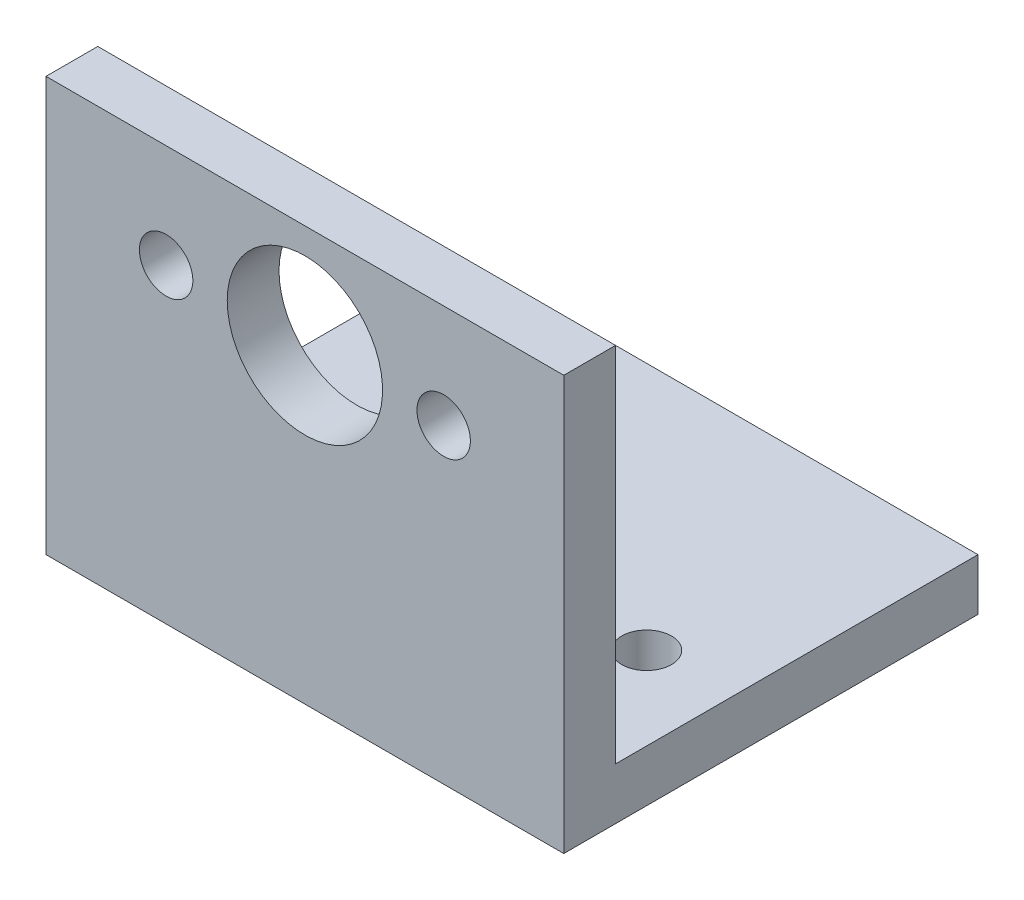
ISO-10303-21;
HEADER;
FILE_DESCRIPTION(('STEP AP214'),'2;1');
FILE_NAME('part.step','',(''),(''),'','','');
FILE_SCHEMA(('AUTOMOTIVE_DESIGN { 1 0 10303 214 1 1 1 1 }'));
ENDSEC;
DATA;
#1=APPLICATION_CONTEXT('core data for automotive mechanical design processes');
#2=APPLICATION_PROTOCOL_DEFINITION('international standard','automotive_design',2000,#1);
#3=PRODUCT_CONTEXT('',#1,'mechanical');
#4=PRODUCT('Part','Part','',(#3));
#5=PRODUCT_RELATED_PRODUCT_CATEGORY('part','',(#4));
#6=PRODUCT_DEFINITION_FORMATION('','',#4);
#7=PRODUCT_DEFINITION_CONTEXT('part definition',#1,'design');
#8=PRODUCT_DEFINITION('design','',#6,#7);
#9=PRODUCT_DEFINITION_SHAPE('','',#8);
#10=(LENGTH_UNIT() NAMED_UNIT(*) SI_UNIT(.MILLI.,.METRE.));
#11=(NAMED_UNIT(*) PLANE_ANGLE_UNIT() SI_UNIT($,.RADIAN.));
#12=(NAMED_UNIT(*) SI_UNIT($,.STERADIAN.) SOLID_ANGLE_UNIT());
#13=UNCERTAINTY_MEASURE_WITH_UNIT(LENGTH_MEASURE(1.E-05),#10,'distance_accuracy_value','');
#14=(GEOMETRIC_REPRESENTATION_CONTEXT(3) GLOBAL_UNCERTAINTY_ASSIGNED_CONTEXT((#13)) GLOBAL_UNIT_ASSIGNED_CONTEXT((#10,
#11,#12)) REPRESENTATION_CONTEXT('',''));
#15=CARTESIAN_POINT('',(0.,0.,0.));
#16=DIRECTION('',(0.,0.,1.));
#17=DIRECTION('',(1.,0.,0.));
#18=AXIS2_PLACEMENT_3D('',#15,#16,#17);
#19=CARTESIAN_POINT('',(31.75,25.4,0.));
#20=DIRECTION('',(0.,0.,-1.));
#21=DIRECTION('',(0.,1.,0.));
#22=AXIS2_PLACEMENT_3D('',#19,#20,#21);
#23=PLANE('',#22);
#24=CARTESIAN_POINT('',(24.384,19.05,0.));
#25=DIRECTION('',(0.,0.,-1.));
#26=DIRECTION('',(-1.,0.,0.));
#27=AXIS2_PLACEMENT_3D('',#24,#25,#26);
#28=CIRCLE('',#27,1.6383);
#29=CARTESIAN_POINT('',(22.7457,19.05,0.));
#30=VERTEX_POINT('',#29);
#31=EDGE_CURVE('E183',#30,#30,#28,.T.);
#32=ORIENTED_EDGE('',*,*,#31,.T.);
#33=EDGE_LOOP('',(#32));
#34=FACE_BOUND('',#33,.T.);
#35=CARTESIAN_POINT('',(7.366,19.05,0.));
#36=DIRECTION('',(0.,0.,-1.));
#37=DIRECTION('',(-1.,0.,0.));
#38=AXIS2_PLACEMENT_3D('',#35,#36,#37);
#39=CIRCLE('',#38,1.6383);
#40=CARTESIAN_POINT('',(5.7277,19.05,0.));
#41=VERTEX_POINT('',#40);
#42=EDGE_CURVE('E187',#41,#41,#39,.T.);
#43=ORIENTED_EDGE('',*,*,#42,.T.);
#44=EDGE_LOOP('',(#43));
#45=FACE_BOUND('',#44,.T.);
#46=CARTESIAN_POINT('',(15.875,19.05,0.));
#47=DIRECTION('',(0.,0.,-1.));
#48=DIRECTION('',(-1.,0.,0.));
#49=AXIS2_PLACEMENT_3D('',#46,#47,#48);
#50=CIRCLE('',#49,4.7625);
#51=CARTESIAN_POINT('',(11.1125,19.05,0.));
#52=VERTEX_POINT('',#51);
#53=EDGE_CURVE('E133',#52,#52,#50,.T.);
#54=ORIENTED_EDGE('',*,*,#53,.T.);
#55=EDGE_LOOP('',(#54));
#56=FACE_BOUND('',#55,.T.);
#57=DIRECTION('',(0.,-1.,0.));
#58=VECTOR('',#57,1.);
#59=CARTESIAN_POINT('',(0.,25.4,0.));
#60=LINE('',#59,#58);
#61=CARTESIAN_POINT('',(0.,25.4,0.));
#62=VERTEX_POINT('',#61);
#63=CARTESIAN_POINT('',(0.,0.,0.));
#64=VERTEX_POINT('',#63);
#65=EDGE_CURVE('E128',#62,#64,#60,.T.);
#66=ORIENTED_EDGE('',*,*,#65,.T.);
#67=DIRECTION('',(-1.,0.,0.));
#68=VECTOR('',#67,1.);
#69=CARTESIAN_POINT('',(31.75,0.,0.));
#70=LINE('',#69,#68);
#71=CARTESIAN_POINT('',(31.75,0.,0.));
#72=VERTEX_POINT('',#71);
#73=EDGE_CURVE('E11',#72,#64,#70,.T.);
#74=ORIENTED_EDGE('',*,*,#73,.F.);
#75=DIRECTION('',(0.,-1.,0.));
#76=VECTOR('',#75,1.);
#77=CARTESIAN_POINT('',(31.75,25.4,0.));
#78=LINE('',#77,#76);
#79=CARTESIAN_POINT('',(31.75,25.4,0.));
#80=VERTEX_POINT('',#79);
#81=EDGE_CURVE('E145',#80,#72,#78,.T.);
#82=ORIENTED_EDGE('',*,*,#81,.F.);
#83=DIRECTION('',(-1.,0.,0.));
#84=VECTOR('',#83,1.);
#85=CARTESIAN_POINT('',(31.75,25.4,0.));
#86=LINE('',#85,#84);
#87=EDGE_CURVE('E124',#80,#62,#86,.T.);
#88=ORIENTED_EDGE('',*,*,#87,.T.);
#89=EDGE_LOOP('',(#66,#74,#82,#88));
#90=FACE_BOUND('',#89,.T.);
#91=ADVANCED_FACE('F39',(#34,#45,#56,#90),#23,.F.);
#92=CARTESIAN_POINT('',(31.75,0.,0.));
#93=DIRECTION('',(0.,1.,0.));
#94=DIRECTION('',(0.,0.,1.));
#95=AXIS2_PLACEMENT_3D('',#92,#93,#94);
#96=PLANE('',#95);
#97=CARTESIAN_POINT('',(26.67,0.,-10.16));
#98=DIRECTION('',(0.,1.,0.));
#99=DIRECTION('',(0.,0.,1.));
#100=AXIS2_PLACEMENT_3D('',#97,#98,#99);
#101=CIRCLE('',#100,1.524);
#102=CARTESIAN_POINT('',(26.67,0.,-8.636));
#103=VERTEX_POINT('',#102);
#104=EDGE_CURVE('E220',#103,#103,#101,.T.);
#105=ORIENTED_EDGE('',*,*,#104,.T.);
#106=EDGE_LOOP('',(#105));
#107=FACE_BOUND('',#106,.T.);
#108=CARTESIAN_POINT('',(5.08,0.,-21.59));
#109=DIRECTION('',(0.,1.,0.));
#110=DIRECTION('',(0.,0.,1.));
#111=AXIS2_PLACEMENT_3D('',#108,#109,#110);
#112=CIRCLE('',#111,1.524);
#113=CARTESIAN_POINT('',(5.08,0.,-20.066));
#114=VERTEX_POINT('',#113);
#115=EDGE_CURVE('E213',#114,#114,#112,.T.);
#116=ORIENTED_EDGE('',*,*,#115,.T.);
#117=EDGE_LOOP('',(#116));
#118=FACE_BOUND('',#117,.T.);
#119=DIRECTION('',(0.,0.,-1.));
#120=VECTOR('',#119,1.);
#121=CARTESIAN_POINT('',(0.,0.,0.));
#122=LINE('',#121,#120);
#123=CARTESIAN_POINT('',(0.,0.,-25.4));
#124=VERTEX_POINT('',#123);
#125=EDGE_CURVE('E132',#64,#124,#122,.T.);
#126=ORIENTED_EDGE('',*,*,#125,.T.);
#127=DIRECTION('',(-1.,0.,0.));
#128=VECTOR('',#127,1.);
#129=CARTESIAN_POINT('',(31.75,0.,-25.4));
#130=LINE('',#129,#128);
#131=CARTESIAN_POINT('',(31.75,0.,-25.4));
#132=VERTEX_POINT('',#131);
#133=EDGE_CURVE('E48',#132,#124,#130,.T.);
#134=ORIENTED_EDGE('',*,*,#133,.F.);
#135=DIRECTION('',(0.,0.,-1.));
#136=VECTOR('',#135,1.);
#137=CARTESIAN_POINT('',(31.75,0.,0.));
#138=LINE('',#137,#136);
#139=EDGE_CURVE('E93',#72,#132,#138,.T.);
#140=ORIENTED_EDGE('',*,*,#139,.F.);
#141=ORIENTED_EDGE('',*,*,#73,.T.);
#142=EDGE_LOOP('',(#126,#134,#140,#141));
#143=FACE_BOUND('',#142,.T.);
#144=ADVANCED_FACE('F174',(#107,#118,#143),#96,.F.);
#145=CARTESIAN_POINT('',(31.75,0.,-25.4));
#146=DIRECTION('',(0.,0.,1.));
#147=DIRECTION('',(1.,0.,0.));
#148=AXIS2_PLACEMENT_3D('',#145,#146,#147);
#149=PLANE('',#148);
#150=DIRECTION('',(0.,1.,0.));
#151=VECTOR('',#150,1.);
#152=CARTESIAN_POINT('',(0.,0.,-25.4));
#153=LINE('',#152,#151);
#154=CARTESIAN_POINT('',(0.,3.175,-25.4));
#155=VERTEX_POINT('',#154);
#156=EDGE_CURVE('E136',#124,#155,#153,.T.);
#157=ORIENTED_EDGE('',*,*,#156,.T.);
#158=DIRECTION('',(-1.,0.,0.));
#159=VECTOR('',#158,1.);
#160=CARTESIAN_POINT('',(31.75,3.175,-25.4));
#161=LINE('',#160,#159);
#162=CARTESIAN_POINT('',(31.75,3.175,-25.4));
#163=VERTEX_POINT('',#162);
#164=EDGE_CURVE('E117',#163,#155,#161,.T.);
#165=ORIENTED_EDGE('',*,*,#164,.F.);
#166=DIRECTION('',(0.,1.,0.));
#167=VECTOR('',#166,1.);
#168=CARTESIAN_POINT('',(31.75,0.,-25.4));
#169=LINE('',#168,#167);
#170=EDGE_CURVE('E106',#132,#163,#169,.T.);
#171=ORIENTED_EDGE('',*,*,#170,.F.);
#172=ORIENTED_EDGE('',*,*,#133,.T.);
#173=EDGE_LOOP('',(#157,#165,#171,#172));
#174=FACE_BOUND('',#173,.T.);
#175=ADVANCED_FACE('F155',(#174),#149,.F.);
#176=CARTESIAN_POINT('',(31.75,3.175,-25.4));
#177=DIRECTION('',(0.,-1.,0.));
#178=DIRECTION('',(0.,0.,-1.));
#179=AXIS2_PLACEMENT_3D('',#176,#177,#178);
#180=PLANE('',#179);
#181=CARTESIAN_POINT('',(26.67,3.175,-10.16));
#182=DIRECTION('',(0.,1.,0.));
#183=DIRECTION('',(0.,0.,1.));
#184=AXIS2_PLACEMENT_3D('',#181,#182,#183);
#185=CIRCLE('',#184,1.524);
#186=CARTESIAN_POINT('',(26.67,3.175,-8.636));
#187=VERTEX_POINT('',#186);
#188=EDGE_CURVE('E224',#187,#187,#185,.T.);
#189=ORIENTED_EDGE('',*,*,#188,.F.);
#190=EDGE_LOOP('',(#189));
#191=FACE_BOUND('',#190,.T.);
#192=CARTESIAN_POINT('',(5.08,3.175,-21.59));
#193=DIRECTION('',(0.,1.,0.));
#194=DIRECTION('',(0.,0.,1.));
#195=AXIS2_PLACEMENT_3D('',#192,#193,#194);
#196=CIRCLE('',#195,1.524);
#197=CARTESIAN_POINT('',(5.08,3.175,-20.066));
#198=VERTEX_POINT('',#197);
#199=EDGE_CURVE('E216',#198,#198,#196,.T.);
#200=ORIENTED_EDGE('',*,*,#199,.F.);
#201=EDGE_LOOP('',(#200));
#202=FACE_BOUND('',#201,.T.);
#203=DIRECTION('',(0.,0.,1.));
#204=VECTOR('',#203,1.);
#205=CARTESIAN_POINT('',(0.,3.175,-25.4));
#206=LINE('',#205,#204);
#207=CARTESIAN_POINT('',(0.,3.175,-3.175));
#208=VERTEX_POINT('',#207);
#209=EDGE_CURVE('E115',#155,#208,#206,.T.);
#210=ORIENTED_EDGE('',*,*,#209,.T.);
#211=DIRECTION('',(-1.,0.,0.));
#212=VECTOR('',#211,1.);
#213=CARTESIAN_POINT('',(31.75,3.175,-3.175));
#214=LINE('',#213,#212);
#215=CARTESIAN_POINT('',(31.75,3.175,-3.175));
#216=VERTEX_POINT('',#215);
#217=EDGE_CURVE('E112',#216,#208,#214,.T.);
#218=ORIENTED_EDGE('',*,*,#217,.F.);
#219=DIRECTION('',(0.,0.,1.));
#220=VECTOR('',#219,1.);
#221=CARTESIAN_POINT('',(31.75,3.175,-25.4));
#222=LINE('',#221,#220);
#223=EDGE_CURVE('E100',#163,#216,#222,.T.);
#224=ORIENTED_EDGE('',*,*,#223,.F.);
#225=ORIENTED_EDGE('',*,*,#164,.T.);
#226=EDGE_LOOP('',(#210,#218,#224,#225));
#227=FACE_BOUND('',#226,.T.);
#228=ADVANCED_FACE('F113',(#191,#202,#227),#180,.F.);
#229=CARTESIAN_POINT('',(31.75,3.175,-3.175));
#230=DIRECTION('',(0.,0.,1.));
#231=DIRECTION('',(1.,0.,0.));
#232=AXIS2_PLACEMENT_3D('',#229,#230,#231);
#233=PLANE('',#232);
#234=CARTESIAN_POINT('',(24.384,19.05,-3.175));
#235=DIRECTION('',(0.,0.,-1.));
#236=DIRECTION('',(-1.,0.,0.));
#237=AXIS2_PLACEMENT_3D('',#234,#235,#236);
#238=CIRCLE('',#237,1.6383);
#239=CARTESIAN_POINT('',(22.7457,19.05,-3.175));
#240=VERTEX_POINT('',#239);
#241=EDGE_CURVE('E209',#240,#240,#238,.T.);
#242=ORIENTED_EDGE('',*,*,#241,.F.);
#243=EDGE_LOOP('',(#242));
#244=FACE_BOUND('',#243,.T.);
#245=CARTESIAN_POINT('',(7.366,19.05,-3.175));
#246=DIRECTION('',(0.,0.,-1.));
#247=DIRECTION('',(-1.,0.,0.));
#248=AXIS2_PLACEMENT_3D('',#245,#246,#247);
#249=CIRCLE('',#248,1.6383);
#250=CARTESIAN_POINT('',(5.7277,19.05,-3.175));
#251=VERTEX_POINT('',#250);
#252=EDGE_CURVE('E198',#251,#251,#249,.T.);
#253=ORIENTED_EDGE('',*,*,#252,.F.);
#254=EDGE_LOOP('',(#253));
#255=FACE_BOUND('',#254,.T.);
#256=CARTESIAN_POINT('',(15.875,19.05,-3.175));
#257=DIRECTION('',(0.,0.,-1.));
#258=DIRECTION('',(-1.,0.,0.));
#259=AXIS2_PLACEMENT_3D('',#256,#257,#258);
#260=CIRCLE('',#259,4.7625);
#261=CARTESIAN_POINT('',(11.1125,19.05,-3.175));
#262=VERTEX_POINT('',#261);
#263=EDGE_CURVE('E192',#262,#262,#260,.T.);
#264=ORIENTED_EDGE('',*,*,#263,.F.);
#265=EDGE_LOOP('',(#264));
#266=FACE_BOUND('',#265,.T.);
#267=DIRECTION('',(0.,1.,0.));
#268=VECTOR('',#267,1.);
#269=CARTESIAN_POINT('',(0.,3.175,-3.175));
#270=LINE('',#269,#268);
#271=CARTESIAN_POINT('',(0.,25.4,-3.175));
#272=VERTEX_POINT('',#271);
#273=EDGE_CURVE('E79',#208,#272,#270,.T.);
#274=ORIENTED_EDGE('',*,*,#273,.T.);
#275=DIRECTION('',(-1.,0.,0.));
#276=VECTOR('',#275,1.);
#277=CARTESIAN_POINT('',(31.75,25.4,-3.175));
#278=LINE('',#277,#276);
#279=CARTESIAN_POINT('',(31.75,25.4,-3.175));
#280=VERTEX_POINT('',#279);
#281=EDGE_CURVE('E118',#280,#272,#278,.T.);
#282=ORIENTED_EDGE('',*,*,#281,.F.);
#283=DIRECTION('',(0.,1.,0.));
#284=VECTOR('',#283,1.);
#285=CARTESIAN_POINT('',(31.75,3.175,-3.175));
#286=LINE('',#285,#284);
#287=EDGE_CURVE('E104',#216,#280,#286,.T.);
#288=ORIENTED_EDGE('',*,*,#287,.F.);
#289=ORIENTED_EDGE('',*,*,#217,.T.);
#290=EDGE_LOOP('',(#274,#282,#288,#289));
#291=FACE_BOUND('',#290,.T.);
#292=ADVANCED_FACE('F120',(#244,#255,#266,#291),#233,.F.);
#293=CARTESIAN_POINT('',(31.75,25.4,-3.175));
#294=DIRECTION('',(0.,-1.,0.));
#295=DIRECTION('',(0.,0.,-1.));
#296=AXIS2_PLACEMENT_3D('',#293,#294,#295);
#297=PLANE('',#296);
#298=DIRECTION('',(0.,0.,1.));
#299=VECTOR('',#298,1.);
#300=CARTESIAN_POINT('',(0.,25.4,-3.175));
#301=LINE('',#300,#299);
#302=EDGE_CURVE('E85',#272,#62,#301,.T.);
#303=ORIENTED_EDGE('',*,*,#302,.T.);
#304=ORIENTED_EDGE('',*,*,#87,.F.);
#305=DIRECTION('',(0.,0.,1.));
#306=VECTOR('',#305,1.);
#307=CARTESIAN_POINT('',(31.75,25.4,-3.175));
#308=LINE('',#307,#306);
#309=EDGE_CURVE('E56',#280,#80,#308,.T.);
#310=ORIENTED_EDGE('',*,*,#309,.F.);
#311=ORIENTED_EDGE('',*,*,#281,.T.);
#312=EDGE_LOOP('',(#303,#304,#310,#311));
#313=FACE_BOUND('',#312,.T.);
#314=ADVANCED_FACE('F162',(#313),#297,.F.);
#315=CARTESIAN_POINT('',(31.75,0.,0.));
#316=DIRECTION('',(1.,0.,0.));
#317=DIRECTION('',(0.,0.,-1.));
#318=AXIS2_PLACEMENT_3D('',#315,#316,#317);
#319=PLANE('',#318);
#320=ORIENTED_EDGE('',*,*,#81,.T.);
#321=ORIENTED_EDGE('',*,*,#139,.T.);
#322=ORIENTED_EDGE('',*,*,#170,.T.);
#323=ORIENTED_EDGE('',*,*,#223,.T.);
#324=ORIENTED_EDGE('',*,*,#287,.T.);
#325=ORIENTED_EDGE('',*,*,#309,.T.);
#326=EDGE_LOOP('',(#320,#321,#322,#323,#324,#325));
#327=FACE_BOUND('',#326,.T.);
#328=ADVANCED_FACE('F102',(#327),#319,.T.);
#329=CARTESIAN_POINT('',(0.,0.,0.));
#330=DIRECTION('',(1.,0.,0.));
#331=DIRECTION('',(0.,0.,-1.));
#332=AXIS2_PLACEMENT_3D('',#329,#330,#331);
#333=PLANE('',#332);
#334=ORIENTED_EDGE('',*,*,#65,.F.);
#335=ORIENTED_EDGE('',*,*,#302,.F.);
#336=ORIENTED_EDGE('',*,*,#273,.F.);
#337=ORIENTED_EDGE('',*,*,#209,.F.);
#338=ORIENTED_EDGE('',*,*,#156,.F.);
#339=ORIENTED_EDGE('',*,*,#125,.F.);
#340=EDGE_LOOP('',(#334,#335,#336,#337,#338,#339));
#341=FACE_BOUND('',#340,.T.);
#342=ADVANCED_FACE('F158',(#341),#333,.F.);
#343=CARTESIAN_POINT('',(15.875,19.05,0.));
#344=DIRECTION('',(0.,0.,-1.));
#345=DIRECTION('',(-1.,0.,0.));
#346=AXIS2_PLACEMENT_3D('',#343,#344,#345);
#347=CYLINDRICAL_SURFACE('',#346,4.7625);
#348=CARTESIAN_POINT('',(11.1125,19.05,0.));
#349=CARTESIAN_POINT('',(11.1125,19.05,-0.0330729166666666));
#350=CARTESIAN_POINT('',(11.1125,19.05,-0.0661458333333334));
#351=CARTESIAN_POINT('',(11.1125,19.05,-0.132291666666667));
#352=CARTESIAN_POINT('',(11.1125,19.05,-0.165364583333334));
#353=CARTESIAN_POINT('',(11.1125,19.05,-0.231510416666667));
#354=CARTESIAN_POINT('',(11.1125,19.05,-0.264583333333334));
#355=CARTESIAN_POINT('',(11.1125,19.05,-0.330729166666667));
#356=CARTESIAN_POINT('',(11.1125,19.05,-0.363802083333334));
#357=CARTESIAN_POINT('',(11.1125,19.05,-0.429947916666667));
#358=CARTESIAN_POINT('',(11.1125,19.05,-0.463020833333334));
#359=CARTESIAN_POINT('',(11.1125,19.05,-0.529166666666667));
#360=CARTESIAN_POINT('',(11.1125,19.05,-0.562239583333334));
#361=CARTESIAN_POINT('',(11.1125,19.05,-0.628385416666667));
#362=CARTESIAN_POINT('',(11.1125,19.05,-0.661458333333334));
#363=CARTESIAN_POINT('',(11.1125,19.05,-0.727604166666667));
#364=CARTESIAN_POINT('',(11.1125,19.05,-0.760677083333334));
#365=CARTESIAN_POINT('',(11.1125,19.05,-0.826822916666668));
#366=CARTESIAN_POINT('',(11.1125,19.05,-0.859895833333334));
#367=CARTESIAN_POINT('',(11.1125,19.05,-0.926041666666668));
#368=CARTESIAN_POINT('',(11.1125,19.05,-0.959114583333334));
#369=CARTESIAN_POINT('',(11.1125,19.05,-1.02526041666667));
#370=CARTESIAN_POINT('',(11.1125,19.05,-1.05833333333333));
#371=CARTESIAN_POINT('',(11.1125,19.05,-1.12447916666667));
#372=CARTESIAN_POINT('',(11.1125,19.05,-1.15755208333333));
#373=CARTESIAN_POINT('',(11.1125,19.05,-1.22369791666667));
#374=CARTESIAN_POINT('',(11.1125,19.05,-1.25677083333333));
#375=CARTESIAN_POINT('',(11.1125,19.05,-1.32291666666667));
#376=CARTESIAN_POINT('',(11.1125,19.05,-1.35598958333333));
#377=CARTESIAN_POINT('',(11.1125,19.05,-1.42213541666667));
#378=CARTESIAN_POINT('',(11.1125,19.05,-1.45520833333333));
#379=CARTESIAN_POINT('',(11.1125,19.05,-1.52135416666667));
#380=CARTESIAN_POINT('',(11.1125,19.05,-1.55442708333334));
#381=CARTESIAN_POINT('',(11.1125,19.05,-1.62057291666667));
#382=CARTESIAN_POINT('',(11.1125,19.05,-1.65364583333334));
#383=CARTESIAN_POINT('',(11.1125,19.05,-1.71979166666667));
#384=CARTESIAN_POINT('',(11.1125,19.05,-1.75286458333334));
#385=CARTESIAN_POINT('',(11.1125,19.05,-1.81901041666667));
#386=CARTESIAN_POINT('',(11.1125,19.05,-1.85208333333334));
#387=CARTESIAN_POINT('',(11.1125,19.05,-1.91822916666667));
#388=CARTESIAN_POINT('',(11.1125,19.05,-1.95130208333334));
#389=CARTESIAN_POINT('',(11.1125,19.05,-2.01744791666667));
#390=CARTESIAN_POINT('',(11.1125,19.05,-2.05052083333334));
#391=CARTESIAN_POINT('',(11.1125,19.05,-2.11666666666667));
#392=CARTESIAN_POINT('',(11.1125,19.05,-2.14973958333334));
#393=CARTESIAN_POINT('',(11.1125,19.05,-2.21588541666667));
#394=CARTESIAN_POINT('',(11.1125,19.05,-2.24895833333334));
#395=CARTESIAN_POINT('',(11.1125,19.05,-2.31510416666667));
#396=CARTESIAN_POINT('',(11.1125,19.05,-2.34817708333334));
#397=CARTESIAN_POINT('',(11.1125,19.05,-2.41432291666667));
#398=CARTESIAN_POINT('',(11.1125,19.05,-2.44739583333334));
#399=CARTESIAN_POINT('',(11.1125,19.05,-2.51354166666667));
#400=CARTESIAN_POINT('',(11.1125,19.05,-2.54661458333334));
#401=CARTESIAN_POINT('',(11.1125,19.05,-2.61276041666667));
#402=CARTESIAN_POINT('',(11.1125,19.05,-2.64583333333334));
#403=CARTESIAN_POINT('',(11.1125,19.05,-2.71197916666667));
#404=CARTESIAN_POINT('',(11.1125,19.05,-2.74505208333334));
#405=CARTESIAN_POINT('',(11.1125,19.05,-2.81119791666667));
#406=CARTESIAN_POINT('',(11.1125,19.05,-2.84427083333334));
#407=CARTESIAN_POINT('',(11.1125,19.05,-2.91041666666667));
#408=CARTESIAN_POINT('',(11.1125,19.05,-2.94348958333334));
#409=CARTESIAN_POINT('',(11.1125,19.05,-3.00963541666667));
#410=CARTESIAN_POINT('',(11.1125,19.05,-3.04270833333334));
#411=CARTESIAN_POINT('',(11.1125,19.05,-3.10885416666667));
#412=CARTESIAN_POINT('',(11.1125,19.05,-3.14192708333334));
#413=CARTESIAN_POINT('',(11.1125,19.05,-3.175));
#414=B_SPLINE_CURVE_WITH_KNOTS('',3,(#348,#349,#350,#351,#352,#353,#354,#355,#356,#357,#358,
#359,#360,#361,#362,#363,#364,#365,#366,#367,#368,#369,#370,#371,#372,#373,#374,#375,#376,#377,
#378,#379,#380,#381,#382,#383,#384,#385,#386,#387,#388,#389,#390,#391,#392,#393,#394,#395,#396,
#397,#398,#399,#400,#401,#402,#403,#404,#405,#406,#407,#408,#409,#410,#411,#412,#413),
.UNSPECIFIED.,.F.,.F.,(4,2,2,2,2,2,2,2,2,2,2,2,2,2,2,2,2,2,2,2,2,2,2,2,2,2,2,2,2,2,2,2,4),(0.,
0.0992187500000001,0.1984375,0.29765625,0.396875,0.496093750000001,0.595312500000001,
0.694531250000001,0.793750000000001,0.892968750000001,0.992187500000001,1.09140625,1.190625,
1.28984375,1.3890625,1.48828125,1.5875,1.68671875,1.7859375,1.88515625,1.984375,2.08359375,
2.1828125,2.28203125,2.38125,2.48046875,2.5796875,2.67890625,2.778125,2.87734375,2.9765625,
3.07578125,3.175),.UNSPECIFIED.);
#415=EDGE_CURVE('BSEAM259',#52,#262,#414,.T.);
#416=ORIENTED_EDGE('',*,*,#53,.F.);
#417=ORIENTED_EDGE('',*,*,#263,.T.);
#418=ORIENTED_EDGE('',*,*,#415,.T.);
#419=ORIENTED_EDGE('',*,*,#415,.F.);
#420=EDGE_LOOP('',(#416,#418,#417,#419));
#421=FACE_BOUND('',#420,.T.);
#422=ADVANCED_FACE('F259',(#421),#347,.F.);
#423=CARTESIAN_POINT('',(7.366,19.05,0.));
#424=DIRECTION('',(0.,0.,-1.));
#425=DIRECTION('',(-1.,0.,0.));
#426=AXIS2_PLACEMENT_3D('',#423,#424,#425);
#427=CYLINDRICAL_SURFACE('',#426,1.6383);
#428=CARTESIAN_POINT('',(5.7277,19.05,0.));
#429=CARTESIAN_POINT('',(5.7277,19.05,-0.0330729166666666));
#430=CARTESIAN_POINT('',(5.7277,19.05,-0.0661458333333334));
#431=CARTESIAN_POINT('',(5.7277,19.05,-0.132291666666667));
#432=CARTESIAN_POINT('',(5.7277,19.05,-0.165364583333334));
#433=CARTESIAN_POINT('',(5.7277,19.05,-0.231510416666667));
#434=CARTESIAN_POINT('',(5.7277,19.05,-0.264583333333334));
#435=CARTESIAN_POINT('',(5.7277,19.05,-0.330729166666667));
#436=CARTESIAN_POINT('',(5.7277,19.05,-0.363802083333334));
#437=CARTESIAN_POINT('',(5.7277,19.05,-0.429947916666667));
#438=CARTESIAN_POINT('',(5.7277,19.05,-0.463020833333334));
#439=CARTESIAN_POINT('',(5.7277,19.05,-0.529166666666667));
#440=CARTESIAN_POINT('',(5.7277,19.05,-0.562239583333334));
#441=CARTESIAN_POINT('',(5.7277,19.05,-0.628385416666667));
#442=CARTESIAN_POINT('',(5.7277,19.05,-0.661458333333334));
#443=CARTESIAN_POINT('',(5.7277,19.05,-0.727604166666667));
#444=CARTESIAN_POINT('',(5.7277,19.05,-0.760677083333334));
#445=CARTESIAN_POINT('',(5.7277,19.05,-0.826822916666668));
#446=CARTESIAN_POINT('',(5.7277,19.05,-0.859895833333334));
#447=CARTESIAN_POINT('',(5.7277,19.05,-0.926041666666668));
#448=CARTESIAN_POINT('',(5.7277,19.05,-0.959114583333334));
#449=CARTESIAN_POINT('',(5.7277,19.05,-1.02526041666667));
#450=CARTESIAN_POINT('',(5.7277,19.05,-1.05833333333333));
#451=CARTESIAN_POINT('',(5.7277,19.05,-1.12447916666667));
#452=CARTESIAN_POINT('',(5.7277,19.05,-1.15755208333333));
#453=CARTESIAN_POINT('',(5.7277,19.05,-1.22369791666667));
#454=CARTESIAN_POINT('',(5.7277,19.05,-1.25677083333333));
#455=CARTESIAN_POINT('',(5.7277,19.05,-1.32291666666667));
#456=CARTESIAN_POINT('',(5.7277,19.05,-1.35598958333333));
#457=CARTESIAN_POINT('',(5.7277,19.05,-1.42213541666667));
#458=CARTESIAN_POINT('',(5.7277,19.05,-1.45520833333333));
#459=CARTESIAN_POINT('',(5.7277,19.05,-1.52135416666667));
#460=CARTESIAN_POINT('',(5.7277,19.05,-1.55442708333334));
#461=CARTESIAN_POINT('',(5.7277,19.05,-1.62057291666667));
#462=CARTESIAN_POINT('',(5.7277,19.05,-1.65364583333334));
#463=CARTESIAN_POINT('',(5.7277,19.05,-1.71979166666667));
#464=CARTESIAN_POINT('',(5.7277,19.05,-1.75286458333334));
#465=CARTESIAN_POINT('',(5.7277,19.05,-1.81901041666667));
#466=CARTESIAN_POINT('',(5.7277,19.05,-1.85208333333334));
#467=CARTESIAN_POINT('',(5.7277,19.05,-1.91822916666667));
#468=CARTESIAN_POINT('',(5.7277,19.05,-1.95130208333334));
#469=CARTESIAN_POINT('',(5.7277,19.05,-2.01744791666667));
#470=CARTESIAN_POINT('',(5.7277,19.05,-2.05052083333334));
#471=CARTESIAN_POINT('',(5.7277,19.05,-2.11666666666667));
#472=CARTESIAN_POINT('',(5.7277,19.05,-2.14973958333334));
#473=CARTESIAN_POINT('',(5.7277,19.05,-2.21588541666667));
#474=CARTESIAN_POINT('',(5.7277,19.05,-2.24895833333334));
#475=CARTESIAN_POINT('',(5.7277,19.05,-2.31510416666667));
#476=CARTESIAN_POINT('',(5.7277,19.05,-2.34817708333334));
#477=CARTESIAN_POINT('',(5.7277,19.05,-2.41432291666667));
#478=CARTESIAN_POINT('',(5.7277,19.05,-2.44739583333334));
#479=CARTESIAN_POINT('',(5.7277,19.05,-2.51354166666667));
#480=CARTESIAN_POINT('',(5.7277,19.05,-2.54661458333334));
#481=CARTESIAN_POINT('',(5.7277,19.05,-2.61276041666667));
#482=CARTESIAN_POINT('',(5.7277,19.05,-2.64583333333334));
#483=CARTESIAN_POINT('',(5.7277,19.05,-2.71197916666667));
#484=CARTESIAN_POINT('',(5.7277,19.05,-2.74505208333334));
#485=CARTESIAN_POINT('',(5.7277,19.05,-2.81119791666667));
#486=CARTESIAN_POINT('',(5.7277,19.05,-2.84427083333334));
#487=CARTESIAN_POINT('',(5.7277,19.05,-2.91041666666667));
#488=CARTESIAN_POINT('',(5.7277,19.05,-2.94348958333334));
#489=CARTESIAN_POINT('',(5.7277,19.05,-3.00963541666667));
#490=CARTESIAN_POINT('',(5.7277,19.05,-3.04270833333334));
#491=CARTESIAN_POINT('',(5.7277,19.05,-3.10885416666667));
#492=CARTESIAN_POINT('',(5.7277,19.05,-3.14192708333334));
#493=CARTESIAN_POINT('',(5.7277,19.05,-3.175));
#494=B_SPLINE_CURVE_WITH_KNOTS('',3,(#428,#429,#430,#431,#432,#433,#434,#435,#436,#437,#438,
#439,#440,#441,#442,#443,#444,#445,#446,#447,#448,#449,#450,#451,#452,#453,#454,#455,#456,#457,
#458,#459,#460,#461,#462,#463,#464,#465,#466,#467,#468,#469,#470,#471,#472,#473,#474,#475,#476,
#477,#478,#479,#480,#481,#482,#483,#484,#485,#486,#487,#488,#489,#490,#491,#492,#493),
.UNSPECIFIED.,.F.,.F.,(4,2,2,2,2,2,2,2,2,2,2,2,2,2,2,2,2,2,2,2,2,2,2,2,2,2,2,2,2,2,2,2,4),(0.,
0.0992187500000001,0.1984375,0.29765625,0.396875,0.496093750000001,0.595312500000001,
0.694531250000001,0.793750000000001,0.892968750000001,0.992187500000001,1.09140625,1.190625,
1.28984375,1.3890625,1.48828125,1.5875,1.68671875,1.7859375,1.88515625,1.984375,2.08359375,
2.1828125,2.28203125,2.38125,2.48046875,2.5796875,2.67890625,2.778125,2.87734375,2.9765625,
3.07578125,3.175),.UNSPECIFIED.);
#495=EDGE_CURVE('BSEAM252',#41,#251,#494,.T.);
#496=ORIENTED_EDGE('',*,*,#42,.F.);
#497=ORIENTED_EDGE('',*,*,#252,.T.);
#498=ORIENTED_EDGE('',*,*,#495,.T.);
#499=ORIENTED_EDGE('',*,*,#495,.F.);
#500=EDGE_LOOP('',(#496,#498,#497,#499));
#501=FACE_BOUND('',#500,.T.);
#502=ADVANCED_FACE('F252',(#501),#427,.F.);
#503=CARTESIAN_POINT('',(24.384,19.05,0.));
#504=DIRECTION('',(0.,0.,-1.));
#505=DIRECTION('',(-1.,0.,0.));
#506=AXIS2_PLACEMENT_3D('',#503,#504,#505);
#507=CYLINDRICAL_SURFACE('',#506,1.6383);
#508=CARTESIAN_POINT('',(22.7457,19.05,0.));
#509=CARTESIAN_POINT('',(22.7457,19.05,-0.0330729166666666));
#510=CARTESIAN_POINT('',(22.7457,19.05,-0.0661458333333334));
#511=CARTESIAN_POINT('',(22.7457,19.05,-0.132291666666667));
#512=CARTESIAN_POINT('',(22.7457,19.05,-0.165364583333334));
#513=CARTESIAN_POINT('',(22.7457,19.05,-0.231510416666667));
#514=CARTESIAN_POINT('',(22.7457,19.05,-0.264583333333334));
#515=CARTESIAN_POINT('',(22.7457,19.05,-0.330729166666667));
#516=CARTESIAN_POINT('',(22.7457,19.05,-0.363802083333334));
#517=CARTESIAN_POINT('',(22.7457,19.05,-0.429947916666667));
#518=CARTESIAN_POINT('',(22.7457,19.05,-0.463020833333334));
#519=CARTESIAN_POINT('',(22.7457,19.05,-0.529166666666667));
#520=CARTESIAN_POINT('',(22.7457,19.05,-0.562239583333334));
#521=CARTESIAN_POINT('',(22.7457,19.05,-0.628385416666667));
#522=CARTESIAN_POINT('',(22.7457,19.05,-0.661458333333334));
#523=CARTESIAN_POINT('',(22.7457,19.05,-0.727604166666667));
#524=CARTESIAN_POINT('',(22.7457,19.05,-0.760677083333334));
#525=CARTESIAN_POINT('',(22.7457,19.05,-0.826822916666668));
#526=CARTESIAN_POINT('',(22.7457,19.05,-0.859895833333334));
#527=CARTESIAN_POINT('',(22.7457,19.05,-0.926041666666668));
#528=CARTESIAN_POINT('',(22.7457,19.05,-0.959114583333334));
#529=CARTESIAN_POINT('',(22.7457,19.05,-1.02526041666667));
#530=CARTESIAN_POINT('',(22.7457,19.05,-1.05833333333333));
#531=CARTESIAN_POINT('',(22.7457,19.05,-1.12447916666667));
#532=CARTESIAN_POINT('',(22.7457,19.05,-1.15755208333333));
#533=CARTESIAN_POINT('',(22.7457,19.05,-1.22369791666667));
#534=CARTESIAN_POINT('',(22.7457,19.05,-1.25677083333333));
#535=CARTESIAN_POINT('',(22.7457,19.05,-1.32291666666667));
#536=CARTESIAN_POINT('',(22.7457,19.05,-1.35598958333333));
#537=CARTESIAN_POINT('',(22.7457,19.05,-1.42213541666667));
#538=CARTESIAN_POINT('',(22.7457,19.05,-1.45520833333333));
#539=CARTESIAN_POINT('',(22.7457,19.05,-1.52135416666667));
#540=CARTESIAN_POINT('',(22.7457,19.05,-1.55442708333334));
#541=CARTESIAN_POINT('',(22.7457,19.05,-1.62057291666667));
#542=CARTESIAN_POINT('',(22.7457,19.05,-1.65364583333334));
#543=CARTESIAN_POINT('',(22.7457,19.05,-1.71979166666667));
#544=CARTESIAN_POINT('',(22.7457,19.05,-1.75286458333334));
#545=CARTESIAN_POINT('',(22.7457,19.05,-1.81901041666667));
#546=CARTESIAN_POINT('',(22.7457,19.05,-1.85208333333334));
#547=CARTESIAN_POINT('',(22.7457,19.05,-1.91822916666667));
#548=CARTESIAN_POINT('',(22.7457,19.05,-1.95130208333334));
#549=CARTESIAN_POINT('',(22.7457,19.05,-2.01744791666667));
#550=CARTESIAN_POINT('',(22.7457,19.05,-2.05052083333334));
#551=CARTESIAN_POINT('',(22.7457,19.05,-2.11666666666667));
#552=CARTESIAN_POINT('',(22.7457,19.05,-2.14973958333334));
#553=CARTESIAN_POINT('',(22.7457,19.05,-2.21588541666667));
#554=CARTESIAN_POINT('',(22.7457,19.05,-2.24895833333334));
#555=CARTESIAN_POINT('',(22.7457,19.05,-2.31510416666667));
#556=CARTESIAN_POINT('',(22.7457,19.05,-2.34817708333334));
#557=CARTESIAN_POINT('',(22.7457,19.05,-2.41432291666667));
#558=CARTESIAN_POINT('',(22.7457,19.05,-2.44739583333334));
#559=CARTESIAN_POINT('',(22.7457,19.05,-2.51354166666667));
#560=CARTESIAN_POINT('',(22.7457,19.05,-2.54661458333334));
#561=CARTESIAN_POINT('',(22.7457,19.05,-2.61276041666667));
#562=CARTESIAN_POINT('',(22.7457,19.05,-2.64583333333334));
#563=CARTESIAN_POINT('',(22.7457,19.05,-2.71197916666667));
#564=CARTESIAN_POINT('',(22.7457,19.05,-2.74505208333334));
#565=CARTESIAN_POINT('',(22.7457,19.05,-2.81119791666667));
#566=CARTESIAN_POINT('',(22.7457,19.05,-2.84427083333334));
#567=CARTESIAN_POINT('',(22.7457,19.05,-2.91041666666667));
#568=CARTESIAN_POINT('',(22.7457,19.05,-2.94348958333334));
#569=CARTESIAN_POINT('',(22.7457,19.05,-3.00963541666667));
#570=CARTESIAN_POINT('',(22.7457,19.05,-3.04270833333334));
#571=CARTESIAN_POINT('',(22.7457,19.05,-3.10885416666667));
#572=CARTESIAN_POINT('',(22.7457,19.05,-3.14192708333334));
#573=CARTESIAN_POINT('',(22.7457,19.05,-3.175));
#574=B_SPLINE_CURVE_WITH_KNOTS('',3,(#508,#509,#510,#511,#512,#513,#514,#515,#516,#517,#518,
#519,#520,#521,#522,#523,#524,#525,#526,#527,#528,#529,#530,#531,#532,#533,#534,#535,#536,#537,
#538,#539,#540,#541,#542,#543,#544,#545,#546,#547,#548,#549,#550,#551,#552,#553,#554,#555,#556,
#557,#558,#559,#560,#561,#562,#563,#564,#565,#566,#567,#568,#569,#570,#571,#572,#573),
.UNSPECIFIED.,.F.,.F.,(4,2,2,2,2,2,2,2,2,2,2,2,2,2,2,2,2,2,2,2,2,2,2,2,2,2,2,2,2,2,2,2,4),(0.,
0.0992187500000001,0.1984375,0.29765625,0.396875,0.496093750000001,0.595312500000001,
0.694531250000001,0.793750000000001,0.892968750000001,0.992187500000001,1.09140625,1.190625,
1.28984375,1.3890625,1.48828125,1.5875,1.68671875,1.7859375,1.88515625,1.984375,2.08359375,
2.1828125,2.28203125,2.38125,2.48046875,2.5796875,2.67890625,2.778125,2.87734375,2.9765625,
3.07578125,3.175),.UNSPECIFIED.);
#575=EDGE_CURVE('BSEAM246',#30,#240,#574,.T.);
#576=ORIENTED_EDGE('',*,*,#31,.F.);
#577=ORIENTED_EDGE('',*,*,#241,.T.);
#578=ORIENTED_EDGE('',*,*,#575,.T.);
#579=ORIENTED_EDGE('',*,*,#575,.F.);
#580=EDGE_LOOP('',(#576,#578,#577,#579));
#581=FACE_BOUND('',#580,.T.);
#582=ADVANCED_FACE('F246',(#581),#507,.F.);
#583=CARTESIAN_POINT('',(5.08,0.,-21.59));
#584=DIRECTION('',(0.,1.,0.));
#585=DIRECTION('',(0.,0.,1.));
#586=AXIS2_PLACEMENT_3D('',#583,#584,#585);
#587=CYLINDRICAL_SURFACE('',#586,1.524);
#588=ORIENTED_EDGE('',*,*,#115,.F.);
#589=EDGE_LOOP('',(#588));
#590=FACE_BOUND('',#589,.T.);
#591=ORIENTED_EDGE('',*,*,#199,.T.);
#592=EDGE_LOOP('',(#591));
#593=FACE_BOUND('',#592,.T.);
#594=ADVANCED_FACE('F236',(#590,#593),#587,.F.);
#595=CARTESIAN_POINT('',(26.67,0.,-10.16));
#596=DIRECTION('',(0.,1.,0.));
#597=DIRECTION('',(0.,0.,1.));
#598=AXIS2_PLACEMENT_3D('',#595,#596,#597);
#599=CYLINDRICAL_SURFACE('',#598,1.524);
#600=ORIENTED_EDGE('',*,*,#104,.F.);
#601=EDGE_LOOP('',(#600));
#602=FACE_BOUND('',#601,.T.);
#603=ORIENTED_EDGE('',*,*,#188,.T.);
#604=EDGE_LOOP('',(#603));
#605=FACE_BOUND('',#604,.T.);
#606=ADVANCED_FACE('F233',(#602,#605),#599,.F.);
#607=CLOSED_SHELL('',(#91,#144,#175,#228,#292,#314,#328,#342,#422,#502,#582,#594,#606));
#608=MANIFOLD_SOLID_BREP('B2',#607);
#609=ADVANCED_BREP_SHAPE_REPRESENTATION('',(#18,#608),#14);
#610=SHAPE_DEFINITION_REPRESENTATION(#9,#609);
ENDSEC;
END-ISO-10303-21;
